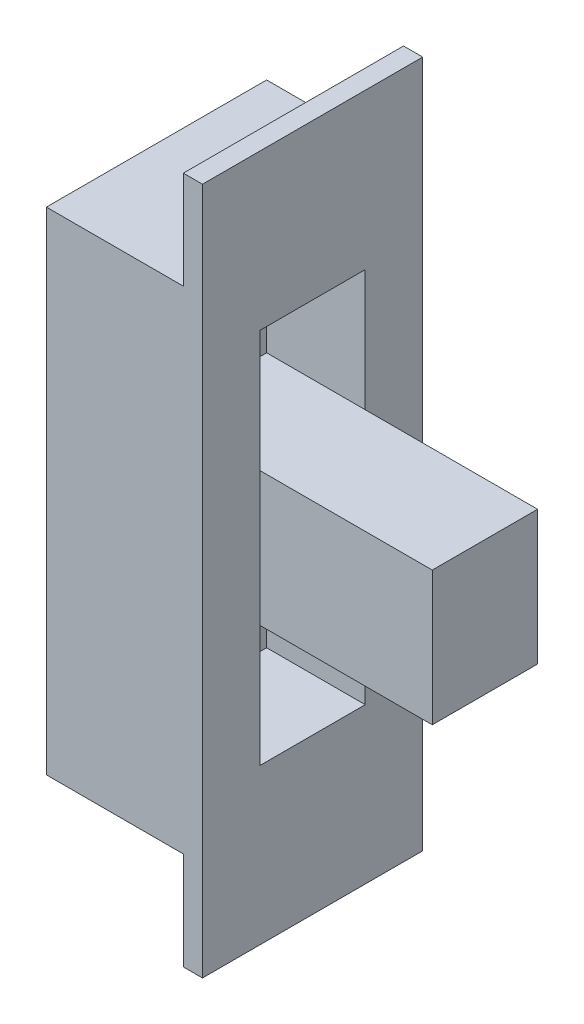
ISO-10303-21;
HEADER;
FILE_DESCRIPTION(('STEP AP214'),'2;1');
FILE_NAME('part.step','',(''),(''),'','','');
FILE_SCHEMA(('AUTOMOTIVE_DESIGN { 1 0 10303 214 1 1 1 1 }'));
ENDSEC;
DATA;
#1=APPLICATION_CONTEXT('core data for automotive mechanical design processes');
#2=APPLICATION_PROTOCOL_DEFINITION('international standard','automotive_design',2000,#1);
#3=PRODUCT_CONTEXT('',#1,'mechanical');
#4=PRODUCT('Part','Part','',(#3));
#5=PRODUCT_RELATED_PRODUCT_CATEGORY('part','',(#4));
#6=PRODUCT_DEFINITION_FORMATION('','',#4);
#7=PRODUCT_DEFINITION_CONTEXT('part definition',#1,'design');
#8=PRODUCT_DEFINITION('design','',#6,#7);
#9=PRODUCT_DEFINITION_SHAPE('','',#8);
#10=(LENGTH_UNIT() NAMED_UNIT(*) SI_UNIT(.MILLI.,.METRE.));
#11=(NAMED_UNIT(*) PLANE_ANGLE_UNIT() SI_UNIT($,.RADIAN.));
#12=(NAMED_UNIT(*) SI_UNIT($,.STERADIAN.) SOLID_ANGLE_UNIT());
#13=UNCERTAINTY_MEASURE_WITH_UNIT(LENGTH_MEASURE(1.E-05),#10,'distance_accuracy_value','');
#14=(GEOMETRIC_REPRESENTATION_CONTEXT(3) GLOBAL_UNCERTAINTY_ASSIGNED_CONTEXT((#13)) GLOBAL_UNIT_ASSIGNED_CONTEXT((#10,
#11,#12)) REPRESENTATION_CONTEXT('',''));
#15=CARTESIAN_POINT('',(0.,0.,0.));
#16=DIRECTION('',(0.,0.,1.));
#17=DIRECTION('',(1.,0.,0.));
#18=AXIS2_PLACEMENT_3D('',#15,#16,#17);
#19=CARTESIAN_POINT('',(-35.8250258301707,28.9408534637666,8.5));
#20=DIRECTION('',(0.,0.,-1.));
#21=DIRECTION('',(-1.,0.,0.));
#22=AXIS2_PLACEMENT_3D('',#19,#20,#21);
#23=PLANE('',#22);
#24=DIRECTION('',(0.,1.,0.));
#25=VECTOR('',#24,1.);
#26=CARTESIAN_POINT('',(-12.3925708076852,28.9408534637666,8.5));
#27=LINE('',#26,#25);
#28=CARTESIAN_POINT('',(-12.3925708076852,28.9408534637666,8.5));
#29=VERTEX_POINT('',#28);
#30=CARTESIAN_POINT('',(-12.3925708076852,35.2793865139848,8.5));
#31=VERTEX_POINT('',#30);
#32=EDGE_CURVE('E235',#29,#31,#27,.T.);
#33=ORIENTED_EDGE('',*,*,#32,.T.);
#34=DIRECTION('',(-1.,0.,0.));
#35=VECTOR('',#34,1.);
#36=CARTESIAN_POINT('',(10.6596760996972,35.2793865139848,8.5));
#37=LINE('',#36,#35);
#38=CARTESIAN_POINT('',(-7.24257080768518,35.2793865139848,8.5));
#39=VERTEX_POINT('',#38);
#40=EDGE_CURVE('E64',#39,#31,#37,.T.);
#41=ORIENTED_EDGE('',*,*,#40,.F.);
#42=DIRECTION('',(0.,1.,0.));
#43=VECTOR('',#42,1.);
#44=CARTESIAN_POINT('',(-7.24257080768518,28.9408534637666,8.5));
#45=LINE('',#44,#43);
#46=CARTESIAN_POINT('',(-7.24257080768518,28.9408534637666,8.5));
#47=VERTEX_POINT('',#46);
#48=EDGE_CURVE('E225',#47,#39,#45,.T.);
#49=ORIENTED_EDGE('',*,*,#48,.F.);
#50=DIRECTION('',(1.,0.,0.));
#51=VECTOR('',#50,1.);
#52=CARTESIAN_POINT('',(-35.8250258301707,28.9408534637666,8.5));
#53=LINE('',#52,#51);
#54=EDGE_CURVE('E230',#29,#47,#53,.T.);
#55=ORIENTED_EDGE('',*,*,#54,.F.);
#56=EDGE_LOOP('',(#33,#41,#49,#55));
#57=FACE_BOUND('',#56,.T.);
#58=ADVANCED_FACE('F41',(#57),#23,.T.);
#59=CARTESIAN_POINT('',(-35.8250258301707,48.6191465362334,3.));
#60=DIRECTION('',(0.,0.,1.));
#61=DIRECTION('',(1.,0.,0.));
#62=AXIS2_PLACEMENT_3D('',#59,#60,#61);
#63=PLANE('',#62);
#64=DIRECTION('',(0.,-1.,0.));
#65=VECTOR('',#64,1.);
#66=CARTESIAN_POINT('',(-7.24257080768518,48.6191465362334,3.));
#67=LINE('',#66,#65);
#68=CARTESIAN_POINT('',(-7.24257080768518,35.2793865139848,3.));
#69=VERTEX_POINT('',#68);
#70=CARTESIAN_POINT('',(-7.24257080768518,28.9408534637666,3.));
#71=VERTEX_POINT('',#70);
#72=EDGE_CURVE('E219',#69,#71,#67,.T.);
#73=ORIENTED_EDGE('',*,*,#72,.F.);
#74=DIRECTION('',(-1.,0.,0.));
#75=VECTOR('',#74,1.);
#76=CARTESIAN_POINT('',(10.6596760996972,35.2793865139848,3.));
#77=LINE('',#76,#75);
#78=CARTESIAN_POINT('',(-12.3925708076852,35.2793865139848,3.));
#79=VERTEX_POINT('',#78);
#80=EDGE_CURVE('E188',#69,#79,#77,.T.);
#81=ORIENTED_EDGE('',*,*,#80,.T.);
#82=DIRECTION('',(0.,-1.,0.));
#83=VECTOR('',#82,1.);
#84=CARTESIAN_POINT('',(-12.3925708076852,48.6191465362334,3.));
#85=LINE('',#84,#83);
#86=CARTESIAN_POINT('',(-12.3925708076852,28.9408534637666,3.));
#87=VERTEX_POINT('',#86);
#88=EDGE_CURVE('E218',#79,#87,#85,.T.);
#89=ORIENTED_EDGE('',*,*,#88,.T.);
#90=DIRECTION('',(1.,0.,0.));
#91=VECTOR('',#90,1.);
#92=CARTESIAN_POINT('',(-35.8250258301707,28.9408534637666,3.));
#93=LINE('',#92,#91);
#94=EDGE_CURVE('E214',#87,#71,#93,.T.);
#95=ORIENTED_EDGE('',*,*,#94,.T.);
#96=EDGE_LOOP('',(#73,#81,#89,#95));
#97=FACE_BOUND('',#96,.T.);
#98=ADVANCED_FACE('F368',(#97),#63,.T.);
#99=CARTESIAN_POINT('',(-12.3925708076852,25.9408534637666,0.));
#100=DIRECTION('',(-1.,0.,0.));
#101=DIRECTION('',(0.,0.,1.));
#102=AXIS2_PLACEMENT_3D('',#99,#100,#101);
#103=PLANE('',#102);
#104=DIRECTION('',(0.,0.,-1.));
#105=VECTOR('',#104,1.);
#106=CARTESIAN_POINT('',(-12.3925708076852,35.2793865139848,8.5));
#107=LINE('',#106,#105);
#108=EDGE_CURVE('E200',#31,#79,#107,.T.);
#109=ORIENTED_EDGE('',*,*,#108,.F.);
#110=ORIENTED_EDGE('',*,*,#32,.F.);
#111=DIRECTION('',(0.,0.,1.));
#112=VECTOR('',#111,1.);
#113=CARTESIAN_POINT('',(-12.3925708076852,28.9408534637666,3.));
#114=LINE('',#113,#112);
#115=EDGE_CURVE('E238',#87,#29,#114,.T.);
#116=ORIENTED_EDGE('',*,*,#115,.F.);
#117=ORIENTED_EDGE('',*,*,#88,.F.);
#118=EDGE_LOOP('',(#109,#110,#116,#117));
#119=FACE_BOUND('',#118,.T.);
#120=ADVANCED_FACE('F341',(#119),#103,.F.);
#121=CARTESIAN_POINT('',(-7.24257080768518,56.73,11.5));
#122=DIRECTION('',(1.,0.,0.));
#123=DIRECTION('',(0.,0.,-1.));
#124=AXIS2_PLACEMENT_3D('',#121,#122,#123);
#125=PLANE('',#124);
#126=DIRECTION('',(0.,-1.,0.));
#127=VECTOR('',#126,1.);
#128=CARTESIAN_POINT('',(-7.24257080768518,56.73,0.));
#129=LINE('',#128,#127);
#130=CARTESIAN_POINT('',(-7.24257080768518,56.73,0.));
#131=VERTEX_POINT('',#130);
#132=CARTESIAN_POINT('',(-7.24257080768518,20.83,0.));
#133=VERTEX_POINT('',#132);
#134=EDGE_CURVE('E280',#131,#133,#129,.T.);
#135=ORIENTED_EDGE('',*,*,#134,.F.);
#136=DIRECTION('',(0.,0.,-1.));
#137=VECTOR('',#136,1.);
#138=CARTESIAN_POINT('',(-7.24257080768518,56.73,11.5));
#139=LINE('',#138,#137);
#140=CARTESIAN_POINT('',(-7.24257080768518,56.73,11.5));
#141=VERTEX_POINT('',#140);
#142=EDGE_CURVE('E288',#141,#131,#139,.T.);
#143=ORIENTED_EDGE('',*,*,#142,.F.);
#144=DIRECTION('',(0.,-1.,0.));
#145=VECTOR('',#144,1.);
#146=CARTESIAN_POINT('',(-7.24257080768518,56.73,11.5));
#147=LINE('',#146,#145);
#148=CARTESIAN_POINT('',(-7.24257080768518,20.83,11.5));
#149=VERTEX_POINT('',#148);
#150=EDGE_CURVE('E285',#141,#149,#147,.T.);
#151=ORIENTED_EDGE('',*,*,#150,.T.);
#152=DIRECTION('',(0.,0.,-1.));
#153=VECTOR('',#152,1.);
#154=CARTESIAN_POINT('',(-7.24257080768518,20.83,11.5));
#155=LINE('',#154,#153);
#156=EDGE_CURVE('E301',#149,#133,#155,.T.);
#157=ORIENTED_EDGE('',*,*,#156,.T.);
#158=EDGE_LOOP('',(#135,#143,#151,#157));
#159=FACE_BOUND('',#158,.T.);
#160=CARTESIAN_POINT('',(-7.24257080768518,48.6191465362334,3.));
#161=VERTEX_POINT('',#160);
#162=CARTESIAN_POINT('',(-7.24257080768518,42.2793865139848,3.));
#163=VERTEX_POINT('',#162);
#164=EDGE_CURVE('E215',#161,#163,#67,.T.);
#165=ORIENTED_EDGE('',*,*,#164,.T.);
#166=DIRECTION('',(0.,-1.,0.));
#167=VECTOR('',#166,1.);
#168=CARTESIAN_POINT('',(-7.24257080768518,56.73,3.));
#169=LINE('',#168,#167);
#170=EDGE_CURVE('E185',#163,#69,#169,.T.);
#171=ORIENTED_EDGE('',*,*,#170,.T.);
#172=ORIENTED_EDGE('',*,*,#72,.T.);
#173=DIRECTION('',(0.,0.,1.));
#174=VECTOR('',#173,1.);
#175=CARTESIAN_POINT('',(-7.24257080768518,28.9408534637666,3.));
#176=LINE('',#175,#174);
#177=EDGE_CURVE('E227',#71,#47,#176,.T.);
#178=ORIENTED_EDGE('',*,*,#177,.T.);
#179=ORIENTED_EDGE('',*,*,#48,.T.);
#180=DIRECTION('',(0.,1.,0.));
#181=VECTOR('',#180,1.);
#182=CARTESIAN_POINT('',(-7.24257080768518,56.73,8.5));
#183=LINE('',#182,#181);
#184=CARTESIAN_POINT('',(-7.24257080768518,42.2793865139848,8.5));
#185=VERTEX_POINT('',#184);
#186=EDGE_CURVE('E210',#39,#185,#183,.T.);
#187=ORIENTED_EDGE('',*,*,#186,.T.);
#188=CARTESIAN_POINT('',(-7.24257080768518,48.6191465362334,8.5));
#189=VERTEX_POINT('',#188);
#190=EDGE_CURVE('E56',#185,#189,#45,.T.);
#191=ORIENTED_EDGE('',*,*,#190,.T.);
#192=DIRECTION('',(0.,0.,-1.));
#193=VECTOR('',#192,1.);
#194=CARTESIAN_POINT('',(-7.24257080768518,48.6191465362334,8.5));
#195=LINE('',#194,#193);
#196=EDGE_CURVE('E220',#189,#161,#195,.T.);
#197=ORIENTED_EDGE('',*,*,#196,.T.);
#198=EDGE_LOOP('',(#165,#171,#172,#178,#179,#187,#191,#197));
#199=FACE_BOUND('',#198,.T.);
#200=ADVANCED_FACE('F338',(#159,#199),#125,.T.);
#201=CARTESIAN_POINT('',(-8.24257080768518,20.83,11.5));
#202=DIRECTION('',(-1.,0.,0.));
#203=DIRECTION('',(0.,0.,1.));
#204=AXIS2_PLACEMENT_3D('',#201,#202,#203);
#205=PLANE('',#204);
#206=DIRECTION('',(0.,1.,0.));
#207=VECTOR('',#206,1.);
#208=CARTESIAN_POINT('',(-8.24257080768518,20.83,0.));
#209=LINE('',#208,#207);
#210=CARTESIAN_POINT('',(-8.24257080768518,51.6191465362334,0.));
#211=VERTEX_POINT('',#210);
#212=CARTESIAN_POINT('',(-8.24257080768518,56.73,0.));
#213=VERTEX_POINT('',#212);
#214=EDGE_CURVE('E291',#211,#213,#209,.T.);
#215=ORIENTED_EDGE('',*,*,#214,.F.);
#216=DIRECTION('',(0.,0.,1.));
#217=VECTOR('',#216,1.);
#218=CARTESIAN_POINT('',(-8.24257080768518,51.6191465362334,0.));
#219=LINE('',#218,#217);
#220=CARTESIAN_POINT('',(-8.24257080768518,51.6191465362334,11.5));
#221=VERTEX_POINT('',#220);
#222=EDGE_CURVE('E253',#211,#221,#219,.T.);
#223=ORIENTED_EDGE('',*,*,#222,.T.);
#224=DIRECTION('',(0.,1.,0.));
#225=VECTOR('',#224,1.);
#226=CARTESIAN_POINT('',(-8.24257080768518,20.83,11.5));
#227=LINE('',#226,#225);
#228=CARTESIAN_POINT('',(-8.24257080768518,56.73,11.5));
#229=VERTEX_POINT('',#228);
#230=EDGE_CURVE('E279',#221,#229,#227,.T.);
#231=ORIENTED_EDGE('',*,*,#230,.T.);
#232=DIRECTION('',(0.,0.,-1.));
#233=VECTOR('',#232,1.);
#234=CARTESIAN_POINT('',(-8.24257080768518,56.73,11.5));
#235=LINE('',#234,#233);
#236=EDGE_CURVE('E12',#229,#213,#235,.T.);
#237=ORIENTED_EDGE('',*,*,#236,.T.);
#238=EDGE_LOOP('',(#215,#223,#231,#237));
#239=FACE_BOUND('',#238,.T.);
#240=ADVANCED_FACE('F332',(#239),#205,.T.);
#241=CARTESIAN_POINT('',(-7.24257080768518,56.73,11.5));
#242=DIRECTION('',(0.,-1.,0.));
#243=DIRECTION('',(0.,0.,-1.));
#244=AXIS2_PLACEMENT_3D('',#241,#242,#243);
#245=PLANE('',#244);
#246=DIRECTION('',(-1.,0.,0.));
#247=VECTOR('',#246,1.);
#248=CARTESIAN_POINT('',(-7.24257080768518,56.73,0.));
#249=LINE('',#248,#247);
#250=EDGE_CURVE('E275',#131,#213,#249,.T.);
#251=ORIENTED_EDGE('',*,*,#250,.T.);
#252=ORIENTED_EDGE('',*,*,#236,.F.);
#253=DIRECTION('',(-1.,0.,0.));
#254=VECTOR('',#253,1.);
#255=CARTESIAN_POINT('',(-7.24257080768518,56.73,11.5));
#256=LINE('',#255,#254);
#257=EDGE_CURVE('E276',#141,#229,#256,.T.);
#258=ORIENTED_EDGE('',*,*,#257,.F.);
#259=ORIENTED_EDGE('',*,*,#142,.T.);
#260=EDGE_LOOP('',(#251,#252,#258,#259));
#261=FACE_BOUND('',#260,.T.);
#262=ADVANCED_FACE('F43',(#261),#245,.F.);
#263=DIRECTION('',(0.,0.,1.));
#264=VECTOR('',#263,1.);
#265=CARTESIAN_POINT('',(-8.24257080768518,25.9408534637666,0.));
#266=LINE('',#265,#264);
#267=CARTESIAN_POINT('',(-8.24257080768518,25.9408534637666,0.));
#268=VERTEX_POINT('',#267);
#269=CARTESIAN_POINT('',(-8.24257080768518,25.9408534637666,11.5));
#270=VERTEX_POINT('',#269);
#271=EDGE_CURVE('E234',#268,#270,#266,.T.);
#272=ORIENTED_EDGE('',*,*,#271,.F.);
#273=CARTESIAN_POINT('',(-8.24257080768518,20.83,0.));
#274=VERTEX_POINT('',#273);
#275=EDGE_CURVE('E292',#274,#268,#209,.T.);
#276=ORIENTED_EDGE('',*,*,#275,.F.);
#277=DIRECTION('',(0.,0.,-1.));
#278=VECTOR('',#277,1.);
#279=CARTESIAN_POINT('',(-8.24257080768518,20.83,11.5));
#280=LINE('',#279,#278);
#281=CARTESIAN_POINT('',(-8.24257080768518,20.83,11.5));
#282=VERTEX_POINT('',#281);
#283=EDGE_CURVE('E49',#282,#274,#280,.T.);
#284=ORIENTED_EDGE('',*,*,#283,.F.);
#285=EDGE_CURVE('E281',#282,#270,#227,.T.);
#286=ORIENTED_EDGE('',*,*,#285,.T.);
#287=EDGE_LOOP('',(#272,#276,#284,#286));
#288=FACE_BOUND('',#287,.T.);
#289=ADVANCED_FACE('F315',(#288),#205,.T.);
#290=CARTESIAN_POINT('',(-8.24257080768518,20.83,11.5));
#291=DIRECTION('',(0.,1.,0.));
#292=DIRECTION('',(0.,0.,1.));
#293=AXIS2_PLACEMENT_3D('',#290,#291,#292);
#294=PLANE('',#293);
#295=DIRECTION('',(1.,0.,0.));
#296=VECTOR('',#295,1.);
#297=CARTESIAN_POINT('',(-8.24257080768518,20.83,0.));
#298=LINE('',#297,#296);
#299=EDGE_CURVE('E295',#274,#133,#298,.T.);
#300=ORIENTED_EDGE('',*,*,#299,.T.);
#301=ORIENTED_EDGE('',*,*,#156,.F.);
#302=DIRECTION('',(1.,0.,0.));
#303=VECTOR('',#302,1.);
#304=CARTESIAN_POINT('',(-8.24257080768518,20.83,11.5));
#305=LINE('',#304,#303);
#306=EDGE_CURVE('E283',#282,#149,#305,.T.);
#307=ORIENTED_EDGE('',*,*,#306,.F.);
#308=ORIENTED_EDGE('',*,*,#283,.T.);
#309=EDGE_LOOP('',(#300,#301,#307,#308));
#310=FACE_BOUND('',#309,.T.);
#311=ADVANCED_FACE('F305',(#310),#294,.F.);
#312=CARTESIAN_POINT('',(-8.24257080768518,56.73,11.5));
#313=DIRECTION('',(0.,0.,-1.));
#314=DIRECTION('',(-1.,0.,0.));
#315=AXIS2_PLACEMENT_3D('',#312,#313,#314);
#316=PLANE('',#315);
#317=ORIENTED_EDGE('',*,*,#257,.T.);
#318=ORIENTED_EDGE('',*,*,#230,.F.);
#319=DIRECTION('',(1.,0.,0.));
#320=VECTOR('',#319,1.);
#321=CARTESIAN_POINT('',(-15.3925708076852,51.6191465362334,11.5));
#322=LINE('',#321,#320);
#323=CARTESIAN_POINT('',(-15.3925708076852,51.6191465362334,11.5));
#324=VERTEX_POINT('',#323);
#325=EDGE_CURVE('E266',#324,#221,#322,.T.);
#326=ORIENTED_EDGE('',*,*,#325,.F.);
#327=DIRECTION('',(0.,1.,0.));
#328=VECTOR('',#327,1.);
#329=CARTESIAN_POINT('',(-15.3925708076852,25.9408534637666,11.5));
#330=LINE('',#329,#328);
#331=CARTESIAN_POINT('',(-15.3925708076852,25.9408534637666,11.5));
#332=VERTEX_POINT('',#331);
#333=EDGE_CURVE('E255',#332,#324,#330,.T.);
#334=ORIENTED_EDGE('',*,*,#333,.F.);
#335=DIRECTION('',(1.,0.,0.));
#336=VECTOR('',#335,1.);
#337=CARTESIAN_POINT('',(-15.3925708076852,25.9408534637666,11.5));
#338=LINE('',#337,#336);
#339=EDGE_CURVE('E269',#332,#270,#338,.T.);
#340=ORIENTED_EDGE('',*,*,#339,.T.);
#341=ORIENTED_EDGE('',*,*,#285,.F.);
#342=ORIENTED_EDGE('',*,*,#306,.T.);
#343=ORIENTED_EDGE('',*,*,#150,.F.);
#344=EDGE_LOOP('',(#317,#318,#326,#334,#340,#341,#342,#343));
#345=FACE_BOUND('',#344,.T.);
#346=ADVANCED_FACE('F321',(#345),#316,.F.);
#347=CARTESIAN_POINT('',(-8.24257080768518,56.73,0.));
#348=DIRECTION('',(0.,0.,-1.));
#349=DIRECTION('',(-1.,0.,0.));
#350=AXIS2_PLACEMENT_3D('',#347,#348,#349);
#351=PLANE('',#350);
#352=ORIENTED_EDGE('',*,*,#250,.F.);
#353=ORIENTED_EDGE('',*,*,#134,.T.);
#354=ORIENTED_EDGE('',*,*,#299,.F.);
#355=ORIENTED_EDGE('',*,*,#275,.T.);
#356=DIRECTION('',(1.,0.,0.));
#357=VECTOR('',#356,1.);
#358=CARTESIAN_POINT('',(-15.3925708076852,25.9408534637666,0.));
#359=LINE('',#358,#357);
#360=CARTESIAN_POINT('',(-15.3925708076852,25.9408534637666,0.));
#361=VERTEX_POINT('',#360);
#362=EDGE_CURVE('E272',#361,#268,#359,.T.);
#363=ORIENTED_EDGE('',*,*,#362,.F.);
#364=DIRECTION('',(0.,-1.,0.));
#365=VECTOR('',#364,1.);
#366=CARTESIAN_POINT('',(-15.3925708076852,51.6191465362334,0.));
#367=LINE('',#366,#365);
#368=CARTESIAN_POINT('',(-15.3925708076852,51.6191465362334,0.));
#369=VERTEX_POINT('',#368);
#370=EDGE_CURVE('E249',#369,#361,#367,.T.);
#371=ORIENTED_EDGE('',*,*,#370,.F.);
#372=DIRECTION('',(1.,0.,0.));
#373=VECTOR('',#372,1.);
#374=CARTESIAN_POINT('',(-15.3925708076852,51.6191465362334,0.));
#375=LINE('',#374,#373);
#376=EDGE_CURVE('E260',#369,#211,#375,.T.);
#377=ORIENTED_EDGE('',*,*,#376,.T.);
#378=ORIENTED_EDGE('',*,*,#214,.T.);
#379=EDGE_LOOP('',(#352,#353,#354,#355,#363,#371,#377,#378));
#380=FACE_BOUND('',#379,.T.);
#381=ADVANCED_FACE('F312',(#380),#351,.T.);
#382=CARTESIAN_POINT('',(-15.3925708076852,25.9408534637666,0.));
#383=DIRECTION('',(0.,1.,0.));
#384=DIRECTION('',(0.,0.,1.));
#385=AXIS2_PLACEMENT_3D('',#382,#383,#384);
#386=PLANE('',#385);
#387=ORIENTED_EDGE('',*,*,#271,.T.);
#388=ORIENTED_EDGE('',*,*,#339,.F.);
#389=DIRECTION('',(0.,0.,1.));
#390=VECTOR('',#389,1.);
#391=CARTESIAN_POINT('',(-15.3925708076852,25.9408534637666,0.));
#392=LINE('',#391,#390);
#393=EDGE_CURVE('E252',#361,#332,#392,.T.);
#394=ORIENTED_EDGE('',*,*,#393,.F.);
#395=ORIENTED_EDGE('',*,*,#362,.T.);
#396=EDGE_LOOP('',(#387,#388,#394,#395));
#397=FACE_BOUND('',#396,.T.);
#398=ADVANCED_FACE('F318',(#397),#386,.F.);
#399=CARTESIAN_POINT('',(-15.3925708076852,51.6191465362334,0.));
#400=DIRECTION('',(0.,1.,0.));
#401=DIRECTION('',(0.,0.,1.));
#402=AXIS2_PLACEMENT_3D('',#399,#400,#401);
#403=PLANE('',#402);
#404=ORIENTED_EDGE('',*,*,#222,.F.);
#405=ORIENTED_EDGE('',*,*,#376,.F.);
#406=DIRECTION('',(0.,0.,1.));
#407=VECTOR('',#406,1.);
#408=CARTESIAN_POINT('',(-15.3925708076852,51.6191465362334,0.));
#409=LINE('',#408,#407);
#410=EDGE_CURVE('E257',#369,#324,#409,.T.);
#411=ORIENTED_EDGE('',*,*,#410,.T.);
#412=ORIENTED_EDGE('',*,*,#325,.T.);
#413=EDGE_LOOP('',(#404,#405,#411,#412));
#414=FACE_BOUND('',#413,.T.);
#415=ADVANCED_FACE('F330',(#414),#403,.T.);
#416=CARTESIAN_POINT('',(-15.3925708076852,25.9408534637666,0.));
#417=DIRECTION('',(-1.,0.,0.));
#418=DIRECTION('',(0.,0.,1.));
#419=AXIS2_PLACEMENT_3D('',#416,#417,#418);
#420=PLANE('',#419);
#421=ORIENTED_EDGE('',*,*,#370,.T.);
#422=ORIENTED_EDGE('',*,*,#393,.T.);
#423=ORIENTED_EDGE('',*,*,#333,.T.);
#424=ORIENTED_EDGE('',*,*,#410,.F.);
#425=EDGE_LOOP('',(#421,#422,#423,#424));
#426=FACE_BOUND('',#425,.T.);
#427=ADVANCED_FACE('F326',(#426),#420,.T.);
#428=CARTESIAN_POINT('',(-35.8250258301707,28.9408534637666,3.));
#429=DIRECTION('',(0.,1.,0.));
#430=DIRECTION('',(0.,0.,1.));
#431=AXIS2_PLACEMENT_3D('',#428,#429,#430);
#432=PLANE('',#431);
#433=ORIENTED_EDGE('',*,*,#115,.T.);
#434=ORIENTED_EDGE('',*,*,#54,.T.);
#435=ORIENTED_EDGE('',*,*,#177,.F.);
#436=ORIENTED_EDGE('',*,*,#94,.F.);
#437=EDGE_LOOP('',(#433,#434,#435,#436));
#438=FACE_BOUND('',#437,.T.);
#439=ADVANCED_FACE('F366',(#438),#432,.T.);
#440=DIRECTION('',(-1.,0.,0.));
#441=VECTOR('',#440,1.);
#442=CARTESIAN_POINT('',(10.6596760996972,42.2793865139848,8.5));
#443=LINE('',#442,#441);
#444=CARTESIAN_POINT('',(-12.3925708076852,42.2793865139848,8.5));
#445=VERTEX_POINT('',#444);
#446=EDGE_CURVE('E211',#185,#445,#443,.T.);
#447=ORIENTED_EDGE('',*,*,#446,.T.);
#448=CARTESIAN_POINT('',(-12.3925708076852,48.6191465362334,8.5));
#449=VERTEX_POINT('',#448);
#450=EDGE_CURVE('E237',#445,#449,#27,.T.);
#451=ORIENTED_EDGE('',*,*,#450,.T.);
#452=DIRECTION('',(1.,0.,0.));
#453=VECTOR('',#452,1.);
#454=CARTESIAN_POINT('',(-35.8250258301707,48.6191465362334,8.5));
#455=LINE('',#454,#453);
#456=EDGE_CURVE('E224',#449,#189,#455,.T.);
#457=ORIENTED_EDGE('',*,*,#456,.T.);
#458=ORIENTED_EDGE('',*,*,#190,.F.);
#459=EDGE_LOOP('',(#447,#451,#457,#458));
#460=FACE_BOUND('',#459,.T.);
#461=ADVANCED_FACE('F355',(#460),#23,.T.);
#462=CARTESIAN_POINT('',(-35.8250258301707,48.6191465362334,8.5));
#463=DIRECTION('',(0.,-1.,0.));
#464=DIRECTION('',(0.,0.,-1.));
#465=AXIS2_PLACEMENT_3D('',#462,#463,#464);
#466=PLANE('',#465);
#467=DIRECTION('',(0.,0.,-1.));
#468=VECTOR('',#467,1.);
#469=CARTESIAN_POINT('',(-12.3925708076852,48.6191465362334,8.5));
#470=LINE('',#469,#468);
#471=CARTESIAN_POINT('',(-12.3925708076852,48.6191465362334,3.));
#472=VERTEX_POINT('',#471);
#473=EDGE_CURVE('E231',#449,#472,#470,.T.);
#474=ORIENTED_EDGE('',*,*,#473,.T.);
#475=DIRECTION('',(1.,0.,0.));
#476=VECTOR('',#475,1.);
#477=CARTESIAN_POINT('',(-35.8250258301707,48.6191465362334,3.));
#478=LINE('',#477,#476);
#479=EDGE_CURVE('E223',#472,#161,#478,.T.);
#480=ORIENTED_EDGE('',*,*,#479,.T.);
#481=ORIENTED_EDGE('',*,*,#196,.F.);
#482=ORIENTED_EDGE('',*,*,#456,.F.);
#483=EDGE_LOOP('',(#474,#480,#481,#482));
#484=FACE_BOUND('',#483,.T.);
#485=ADVANCED_FACE('F388',(#484),#466,.T.);
#486=DIRECTION('',(-1.,0.,0.));
#487=VECTOR('',#486,1.);
#488=CARTESIAN_POINT('',(10.6596760996972,42.2793865139848,3.));
#489=LINE('',#488,#487);
#490=CARTESIAN_POINT('',(-12.3925708076852,42.2793865139848,3.));
#491=VERTEX_POINT('',#490);
#492=EDGE_CURVE('E189',#163,#491,#489,.T.);
#493=ORIENTED_EDGE('',*,*,#492,.F.);
#494=ORIENTED_EDGE('',*,*,#164,.F.);
#495=ORIENTED_EDGE('',*,*,#479,.F.);
#496=EDGE_CURVE('E241',#472,#491,#85,.T.);
#497=ORIENTED_EDGE('',*,*,#496,.T.);
#498=EDGE_LOOP('',(#493,#494,#495,#497));
#499=FACE_BOUND('',#498,.T.);
#500=ADVANCED_FACE('F347',(#499),#63,.T.);
#501=ORIENTED_EDGE('',*,*,#450,.F.);
#502=DIRECTION('',(0.,0.,-1.));
#503=VECTOR('',#502,1.);
#504=CARTESIAN_POINT('',(-12.3925708076852,42.2793865139848,8.5));
#505=LINE('',#504,#503);
#506=EDGE_CURVE('E178',#445,#491,#505,.T.);
#507=ORIENTED_EDGE('',*,*,#506,.T.);
#508=ORIENTED_EDGE('',*,*,#496,.F.);
#509=ORIENTED_EDGE('',*,*,#473,.F.);
#510=EDGE_LOOP('',(#501,#507,#508,#509));
#511=FACE_BOUND('',#510,.T.);
#512=ADVANCED_FACE('F352',(#511),#103,.F.);
#513=CARTESIAN_POINT('',(1.75742919231482,56.73,11.5));
#514=DIRECTION('',(1.,0.,0.));
#515=DIRECTION('',(0.,0.,-1.));
#516=AXIS2_PLACEMENT_3D('',#513,#514,#515);
#517=PLANE('',#516);
#518=DIRECTION('',(0.,0.,-1.));
#519=VECTOR('',#518,1.);
#520=CARTESIAN_POINT('',(1.75742919231482,42.2793865139848,8.5));
#521=LINE('',#520,#519);
#522=CARTESIAN_POINT('',(1.75742919231482,42.2793865139848,8.5));
#523=VERTEX_POINT('',#522);
#524=CARTESIAN_POINT('',(1.75742919231482,42.2793865139848,3.));
#525=VERTEX_POINT('',#524);
#526=EDGE_CURVE('E171',#523,#525,#521,.T.);
#527=ORIENTED_EDGE('',*,*,#526,.F.);
#528=DIRECTION('',(0.,-1.,0.));
#529=VECTOR('',#528,1.);
#530=CARTESIAN_POINT('',(1.75742919231482,42.2793865139848,8.5));
#531=LINE('',#530,#529);
#532=CARTESIAN_POINT('',(1.75742919231482,35.2793865139848,8.5));
#533=VERTEX_POINT('',#532);
#534=EDGE_CURVE('E201',#523,#533,#531,.T.);
#535=ORIENTED_EDGE('',*,*,#534,.T.);
#536=DIRECTION('',(0.,0.,-1.));
#537=VECTOR('',#536,1.);
#538=CARTESIAN_POINT('',(1.75742919231482,35.2793865139848,8.5));
#539=LINE('',#538,#537);
#540=CARTESIAN_POINT('',(1.75742919231482,35.2793865139848,3.));
#541=VERTEX_POINT('',#540);
#542=EDGE_CURVE('E174',#533,#541,#539,.T.);
#543=ORIENTED_EDGE('',*,*,#542,.T.);
#544=DIRECTION('',(0.,1.,0.));
#545=VECTOR('',#544,1.);
#546=CARTESIAN_POINT('',(1.75742919231482,35.2793865139848,3.));
#547=LINE('',#546,#545);
#548=EDGE_CURVE('E167',#541,#525,#547,.T.);
#549=ORIENTED_EDGE('',*,*,#548,.T.);
#550=EDGE_LOOP('',(#527,#535,#543,#549));
#551=FACE_BOUND('',#550,.T.);
#552=ADVANCED_FACE('F169',(#551),#517,.T.);
#553=CARTESIAN_POINT('',(10.6596760996972,42.2793865139848,8.5));
#554=DIRECTION('',(0.,1.,0.));
#555=DIRECTION('',(0.,0.,1.));
#556=AXIS2_PLACEMENT_3D('',#553,#554,#555);
#557=PLANE('',#556);
#558=EDGE_CURVE('E195',#523,#185,#443,.T.);
#559=ORIENTED_EDGE('',*,*,#558,.F.);
#560=ORIENTED_EDGE('',*,*,#526,.T.);
#561=EDGE_CURVE('E182',#525,#163,#489,.T.);
#562=ORIENTED_EDGE('',*,*,#561,.T.);
#563=ORIENTED_EDGE('',*,*,#492,.T.);
#564=ORIENTED_EDGE('',*,*,#506,.F.);
#565=ORIENTED_EDGE('',*,*,#446,.F.);
#566=EDGE_LOOP('',(#559,#560,#562,#563,#564,#565));
#567=FACE_BOUND('',#566,.T.);
#568=ADVANCED_FACE('F192',(#567),#557,.T.);
#569=CARTESIAN_POINT('',(10.6596760996972,35.2793865139848,3.));
#570=DIRECTION('',(0.,0.,1.));
#571=DIRECTION('',(1.,0.,0.));
#572=AXIS2_PLACEMENT_3D('',#569,#570,#571);
#573=PLANE('',#572);
#574=ORIENTED_EDGE('',*,*,#170,.F.);
#575=ORIENTED_EDGE('',*,*,#561,.F.);
#576=ORIENTED_EDGE('',*,*,#548,.F.);
#577=EDGE_CURVE('E207',#541,#69,#77,.T.);
#578=ORIENTED_EDGE('',*,*,#577,.T.);
#579=EDGE_LOOP('',(#574,#575,#576,#578));
#580=FACE_BOUND('',#579,.T.);
#581=ADVANCED_FACE('F183',(#580),#573,.F.);
#582=CARTESIAN_POINT('',(10.6596760996972,35.2793865139848,8.5));
#583=DIRECTION('',(0.,1.,0.));
#584=DIRECTION('',(0.,0.,1.));
#585=AXIS2_PLACEMENT_3D('',#582,#583,#584);
#586=PLANE('',#585);
#587=ORIENTED_EDGE('',*,*,#542,.F.);
#588=EDGE_CURVE('E204',#533,#39,#37,.T.);
#589=ORIENTED_EDGE('',*,*,#588,.T.);
#590=ORIENTED_EDGE('',*,*,#40,.T.);
#591=ORIENTED_EDGE('',*,*,#108,.T.);
#592=ORIENTED_EDGE('',*,*,#80,.F.);
#593=ORIENTED_EDGE('',*,*,#577,.F.);
#594=EDGE_LOOP('',(#587,#589,#590,#591,#592,#593));
#595=FACE_BOUND('',#594,.T.);
#596=ADVANCED_FACE('F358',(#595),#586,.F.);
#597=CARTESIAN_POINT('',(10.6596760996972,42.2793865139848,8.5));
#598=DIRECTION('',(0.,0.,-1.));
#599=DIRECTION('',(-1.,0.,0.));
#600=AXIS2_PLACEMENT_3D('',#597,#598,#599);
#601=PLANE('',#600);
#602=ORIENTED_EDGE('',*,*,#186,.F.);
#603=ORIENTED_EDGE('',*,*,#588,.F.);
#604=ORIENTED_EDGE('',*,*,#534,.F.);
#605=ORIENTED_EDGE('',*,*,#558,.T.);
#606=EDGE_LOOP('',(#602,#603,#604,#605));
#607=FACE_BOUND('',#606,.T.);
#608=ADVANCED_FACE('F372',(#607),#601,.F.);
#609=CLOSED_SHELL('',(#58,#98,#120,#200,#240,#262,#289,#311,#346,#381,#398,#415,#427,#439,#461,
#485,#500,#512,#552,#568,#581,#596,#608));
#610=MANIFOLD_SOLID_BREP('B2',#609);
#611=ADVANCED_BREP_SHAPE_REPRESENTATION('',(#18,#610),#14);
#612=SHAPE_DEFINITION_REPRESENTATION(#9,#611);
ENDSEC;
END-ISO-10303-21;
